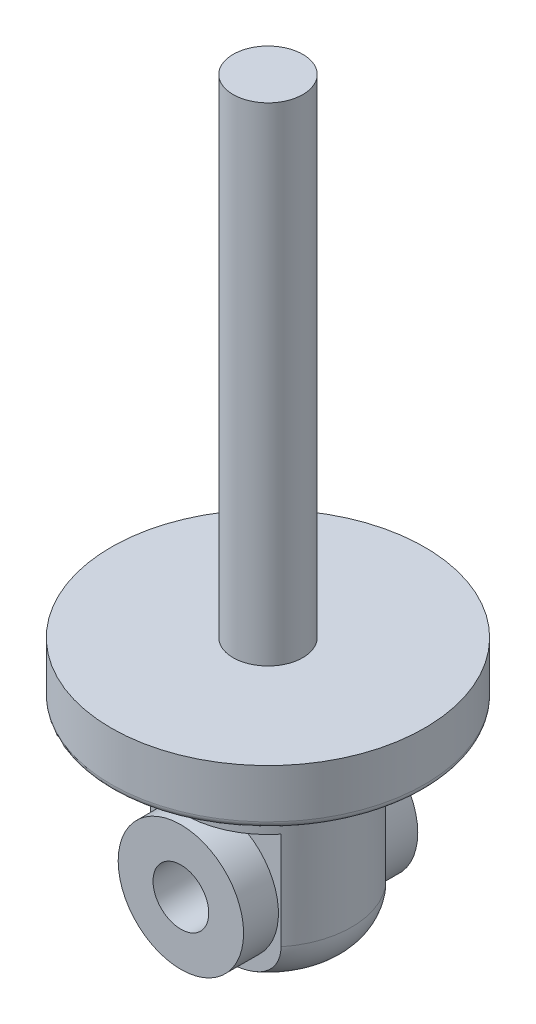
ISO-10303-21;
HEADER;
FILE_DESCRIPTION(('STEP AP214'),'2;1');
FILE_NAME('part.step','',(''),(''),'','','');
FILE_SCHEMA(('AUTOMOTIVE_DESIGN { 1 0 10303 214 1 1 1 1 }'));
ENDSEC;
DATA;
#1=APPLICATION_CONTEXT('core data for automotive mechanical design processes');
#2=APPLICATION_PROTOCOL_DEFINITION('international standard','automotive_design',2000,#1);
#3=PRODUCT_CONTEXT('',#1,'mechanical');
#4=PRODUCT('Part','Part','',(#3));
#5=PRODUCT_RELATED_PRODUCT_CATEGORY('part','',(#4));
#6=PRODUCT_DEFINITION_FORMATION('','',#4);
#7=PRODUCT_DEFINITION_CONTEXT('part definition',#1,'design');
#8=PRODUCT_DEFINITION('design','',#6,#7);
#9=PRODUCT_DEFINITION_SHAPE('','',#8);
#10=(LENGTH_UNIT() NAMED_UNIT(*) SI_UNIT(.MILLI.,.METRE.));
#11=(NAMED_UNIT(*) PLANE_ANGLE_UNIT() SI_UNIT($,.RADIAN.));
#12=(NAMED_UNIT(*) SI_UNIT($,.STERADIAN.) SOLID_ANGLE_UNIT());
#13=UNCERTAINTY_MEASURE_WITH_UNIT(LENGTH_MEASURE(1.E-05),#10,'distance_accuracy_value','');
#14=(GEOMETRIC_REPRESENTATION_CONTEXT(3) GLOBAL_UNCERTAINTY_ASSIGNED_CONTEXT((#13)) GLOBAL_UNIT_ASSIGNED_CONTEXT((#10,
#11,#12)) REPRESENTATION_CONTEXT('',''));
#15=CARTESIAN_POINT('',(0.,0.,0.));
#16=DIRECTION('',(0.,0.,1.));
#17=DIRECTION('',(1.,0.,0.));
#18=AXIS2_PLACEMENT_3D('',#15,#16,#17);
#19=CARTESIAN_POINT('',(-22.5,-28.,-7.5));
#20=DIRECTION('',(0.,0.,1.));
#21=DIRECTION('',(0.,-1.,0.));
#22=AXIS2_PLACEMENT_3D('',#19,#20,#21);
#23=PLANE('',#22);
#24=CARTESIAN_POINT('',(0.,-27.8094750193111,-7.5));
#25=CARTESIAN_POINT('',(-0.18452162824242,-27.8094752958151,-7.5));
#26=CARTESIAN_POINT('',(-0.369043480287192,-27.8077270322999,-7.5));
#27=CARTESIAN_POINT('',(-0.737999394292285,-27.8006130628877,-7.5));
#28=CARTESIAN_POINT('',(-0.922433463434385,-27.7952477367066,-7.5));
#29=CARTESIAN_POINT('',(-1.29122559425462,-27.780538513706,-7.5));
#30=CARTESIAN_POINT('',(-1.47558358999919,-27.7711929215574,-7.5));
#31=CARTESIAN_POINT('',(-1.84401846668315,-27.7479507640883,-7.5));
#32=CARTESIAN_POINT('',(-2.02809534398339,-27.734054140347,-7.5));
#33=CARTESIAN_POINT('',(-2.39498843631837,-27.701027325669,-7.5));
#34=CARTESIAN_POINT('',(-2.57780665418326,-27.6819201299087,-7.5));
#35=CARTESIAN_POINT('',(-2.94269408038083,-27.6375682217561,-7.5));
#36=CARTESIAN_POINT('',(-3.12476323156505,-27.6123230495969,-7.5));
#37=CARTESIAN_POINT('',(-3.6691632505479,-27.5259360262262,-7.5));
#38=CARTESIAN_POINT('',(-4.02997739530099,-27.4541196223952,-7.5));
#39=CARTESIAN_POINT('',(-4.57935988961709,-27.315114172541,-7.5));
#40=CARTESIAN_POINT('',(-4.77122256452969,-27.2608348848703,-7.5));
#41=CARTESIAN_POINT('',(-5.15109529504943,-27.1402411036094,-7.5));
#42=CARTESIAN_POINT('',(-5.33910680786539,-27.0739312594077,-7.5));
#43=CARTESIAN_POINT('',(-5.70992505463463,-26.9281486989919,-7.5));
#44=CARTESIAN_POINT('',(-5.8927332791208,-26.8486797977089,-7.5));
#45=CARTESIAN_POINT('',(-6.25155879665883,-26.6756224712841,-7.5));
#46=CARTESIAN_POINT('',(-6.42757723883459,-26.5820364486501,-7.5));
#47=CARTESIAN_POINT('',(-6.74413785402998,-26.3958384208508,-7.5));
#48=CARTESIAN_POINT('',(-6.8859302136676,-26.3053527427416,-7.5));
#49=CARTESIAN_POINT('',(-7.16205254122039,-26.1136422044668,-7.5));
#50=CARTESIAN_POINT('',(-7.29638393401337,-26.0124194056704,-7.5));
#51=CARTESIAN_POINT('',(-7.55627452274061,-25.7991822855038,-7.5));
#52=CARTESIAN_POINT('',(-7.6818315054992,-25.6871652583255,-7.5));
#53=CARTESIAN_POINT('',(-7.92270374400352,-25.4525813942248,-7.5));
#54=CARTESIAN_POINT('',(-8.03801892249803,-25.3300144777409,-7.5));
#55=CARTESIAN_POINT('',(-8.25792234562975,-25.0736714823962,-7.5));
#56=CARTESIAN_POINT('',(-8.36240569865935,-24.9398051473305,-7.5));
#57=CARTESIAN_POINT('',(-8.55796576900281,-24.662616920615,-7.5));
#58=CARTESIAN_POINT('',(-8.64904436046083,-24.5192963548439,-7.5));
#59=CARTESIAN_POINT('',(-8.81636481076627,-24.2243409104845,-7.5));
#60=CARTESIAN_POINT('',(-8.89261579636783,-24.0727112205184,-7.5));
#61=CARTESIAN_POINT('',(-9.02909243430965,-23.7624095052739,-7.5));
#62=CARTESIAN_POINT('',(-9.08932115899453,-23.6037388369551,-7.5));
#63=CARTESIAN_POINT('',(-9.1849514334904,-23.3052245459151,-7.5));
#64=CARTESIAN_POINT('',(-9.22272405795734,-23.1661361294911,-7.5));
#65=CARTESIAN_POINT('',(-9.28547940350164,-22.8851087613884,-7.5));
#66=CARTESIAN_POINT('',(-9.31046370365637,-22.7431701638949,-7.5));
#67=CARTESIAN_POINT('',(-9.34730641699015,-22.4576599589478,-7.5));
#68=CARTESIAN_POINT('',(-9.35917031033292,-22.3140890586128,-7.5));
#69=CARTESIAN_POINT('',(-9.36963164548865,-22.0264648581988,-7.5));
#70=CARTESIAN_POINT('',(-9.36822954903947,-21.8824115750842,-7.5));
#71=CARTESIAN_POINT('',(-9.35280339576898,-21.6061914815275,-7.5));
#72=CARTESIAN_POINT('',(-9.33976569953801,-21.4739684759153,-7.5));
#73=CARTESIAN_POINT('',(-9.3025636387872,-21.2110534946456,-7.5));
#74=CARTESIAN_POINT('',(-9.27839574533065,-21.0803620180608,-7.5));
#75=CARTESIAN_POINT('',(-9.21922065645586,-20.8215410609612,-7.5));
#76=CARTESIAN_POINT('',(-9.1842198149556,-20.6934101253726,-7.5));
#77=CARTESIAN_POINT('',(-9.1037455253616,-20.4404340442512,-7.5));
#78=CARTESIAN_POINT('',(-9.05826815366643,-20.3155901493276,-7.5));
#79=CARTESIAN_POINT('',(-8.95699564520569,-20.0692031015505,-7.5));
#80=CARTESIAN_POINT('',(-8.90113499399755,-19.9476868658852,-7.5));
#81=CARTESIAN_POINT('',(-8.77987692751896,-19.7094920695403,-7.5));
#82=CARTESIAN_POINT('',(-8.71447610526942,-19.5928152563103,-7.5));
#83=CARTESIAN_POINT('',(-8.50489875856371,-19.2509911073174,-7.5));
#84=CARTESIAN_POINT('',(-8.34729299116934,-19.0339195251877,-7.5));
#85=CARTESIAN_POINT('',(-7.98870608163152,-18.609337427954,-7.5));
#86=CARTESIAN_POINT('',(-7.785297559506,-18.4039002281567,-7.5));
#87=CARTESIAN_POINT('',(-7.35109040646742,-18.0246758733926,-7.5));
#88=CARTESIAN_POINT('',(-7.12029612399674,-17.8508837047537,-7.5));
#89=CARTESIAN_POINT('',(-6.69864287979115,-17.5744409595824,-7.5));
#90=CARTESIAN_POINT('',(-6.51223410047273,-17.4648689537028,-7.5));
#91=CARTESIAN_POINT('',(-6.13034538679085,-17.2626904112623,-7.5));
#92=CARTESIAN_POINT('',(-5.93486117014358,-17.1700919878543,-7.5));
#93=CARTESIAN_POINT('',(-5.53658641063457,-17.0006313082269,-7.5));
#94=CARTESIAN_POINT('',(-5.3337765932138,-16.9238147555949,-7.5));
#95=CARTESIAN_POINT('',(-4.92331428460809,-16.784875362625,-7.5));
#96=CARTESIAN_POINT('',(-4.71566315546473,-16.7227484430634,-7.5));
#97=CARTESIAN_POINT('',(-4.02250667384635,-16.5386673542946,-7.5));
#98=CARTESIAN_POINT('',(-3.52942656369881,-16.4449803111871,-7.5));
#99=CARTESIAN_POINT('',(-2.78498720051465,-16.3412352530644,-7.5));
#100=CARTESIAN_POINT('',(-2.53568557770049,-16.3127705467372,-7.5));
#101=CARTESIAN_POINT('',(-2.03612434937437,-16.2658269581612,-7.5));
#102=CARTESIAN_POINT('',(-1.78586486368141,-16.2473468655649,-7.5));
#103=CARTESIAN_POINT('',(-1.28363112408652,-16.2184283009414,-7.5));
#104=CARTESIAN_POINT('',(-1.0316546617609,-16.208031590786,-7.5));
#105=CARTESIAN_POINT('',(-0.527501194688672,-16.1941849220444,-7.5));
#106=CARTESIAN_POINT('',(-0.275324180848903,-16.1907352988047,-7.5));
#107=CARTESIAN_POINT('',(0.228731345602985,-16.1903333462322,-7.5));
#108=CARTESIAN_POINT('',(0.480609853630185,-16.193373232494,-7.5));
#109=CARTESIAN_POINT('',(0.984173581494278,-16.2063332691715,-7.5));
#110=CARTESIAN_POINT('',(1.23585881660875,-16.2162528039696,-7.5));
#111=CARTESIAN_POINT('',(1.76278825668935,-16.2454935008677,-7.5));
#112=CARTESIAN_POINT('',(2.03798990109172,-16.2656211327378,-7.5));
#113=CARTESIAN_POINT('',(2.58731345976839,-16.3180418431018,-7.5));
#114=CARTESIAN_POINT('',(2.86143522597444,-16.3503365349836,-7.5));
#115=CARTESIAN_POINT('',(3.40623279358437,-16.4300545548583,-7.5));
#116=CARTESIAN_POINT('',(3.67691867401874,-16.4774071358833,-7.5));
#117=CARTESIAN_POINT('',(4.21439476079952,-16.5907053400646,-7.5));
#118=CARTESIAN_POINT('',(4.4811862031647,-16.6566449229111,-7.5));
#119=CARTESIAN_POINT('',(4.94217748017443,-16.7911834026755,-7.5));
#120=CARTESIAN_POINT('',(5.13778160857808,-16.8549558474619,-7.5));
#121=CARTESIAN_POINT('',(5.5239942274174,-16.9961265709521,-7.5));
#122=CARTESIAN_POINT('',(5.71460418712137,-17.073520789267,-7.5));
#123=CARTESIAN_POINT('',(6.0892198722189,-17.2430793617625,-7.5));
#124=CARTESIAN_POINT('',(6.27322442084439,-17.3352463319138,-7.5));
#125=CARTESIAN_POINT('',(6.63256976145457,-17.5351759469553,-7.5));
#126=CARTESIAN_POINT('',(6.80791280693598,-17.6429345063483,-7.5));
#127=CARTESIAN_POINT('',(7.10989658300674,-17.8487615005737,-7.5));
#128=CARTESIAN_POINT('',(7.23870103997639,-17.9436617626469,-7.5));
#129=CARTESIAN_POINT('',(7.48856622066219,-18.143229826346,-7.5));
#130=CARTESIAN_POINT('',(7.60962602152204,-18.2478987883735,-7.5));
#131=CARTESIAN_POINT('',(7.84271387792474,-18.4668045949393,-7.5));
#132=CARTESIAN_POINT('',(7.95474473789612,-18.5810384459287,-7.5));
#133=CARTESIAN_POINT('',(8.16854933672494,-18.8187268203134,-7.5));
#134=CARTESIAN_POINT('',(8.27032449994957,-18.9421800591116,-7.5));
#135=CARTESIAN_POINT('',(8.46313596223061,-19.1987356397018,-7.5));
#136=CARTESIAN_POINT('',(8.55408255407203,-19.3319055781875,-7.5));
#137=CARTESIAN_POINT('',(8.72304401015934,-19.6061418402457,-7.5));
#138=CARTESIAN_POINT('',(8.80106500403696,-19.747204378254,-7.5));
#139=CARTESIAN_POINT('',(8.94309470867639,-20.0362068877473,-7.5));
#140=CARTESIAN_POINT('',(9.00710515749598,-20.1841460034049,-7.5));
#141=CARTESIAN_POINT('',(9.12014361193692,-20.4856380297523,-7.5));
#142=CARTESIAN_POINT('',(9.16917373274798,-20.6391901444676,-7.5));
#143=CARTESIAN_POINT('',(9.24643392787081,-20.9313639562727,-7.5));
#144=CARTESIAN_POINT('',(9.27647685632879,-21.0695088202567,-7.5));
#145=CARTESIAN_POINT('',(9.32406143536891,-21.3479315795213,-7.5));
#146=CARTESIAN_POINT('',(9.34160421520928,-21.4882092809527,-7.5));
#147=CARTESIAN_POINT('',(9.36396002322678,-21.769719609589,-7.5));
#148=CARTESIAN_POINT('',(9.36877802253041,-21.9109518422674,-7.5));
#149=CARTESIAN_POINT('',(9.36563613906261,-22.1932734390957,-7.5));
#150=CARTESIAN_POINT('',(9.35767657732182,-22.3343628067459,-7.5));
#151=CARTESIAN_POINT('',(9.32998563551062,-22.6064011749062,-7.5));
#152=CARTESIAN_POINT('',(9.31102660205278,-22.7374295539783,-7.5));
#153=CARTESIAN_POINT('',(9.26218788836621,-22.9974780227225,-7.5));
#154=CARTESIAN_POINT('',(9.23230470755187,-23.1264974548056,-7.5));
#155=CARTESIAN_POINT('',(9.16196479385525,-23.3815508516768,-7.5));
#156=CARTESIAN_POINT('',(9.12151307666088,-23.5075862018083,-7.5));
#157=CARTESIAN_POINT('',(9.03044888037393,-23.7559772755244,-7.5));
#158=CARTESIAN_POINT('',(8.97983258590813,-23.8783315975104,-7.5));
#159=CARTESIAN_POINT('',(8.8680617574251,-24.1205569584555,-7.5));
#160=CARTESIAN_POINT('',(8.8067487702029,-24.2403549182387,-7.5));
#161=CARTESIAN_POINT('',(8.67480187441993,-24.4747211723639,-7.5));
#162=CARTESIAN_POINT('',(8.60416462323316,-24.5892875713423,-7.5));
#163=CARTESIAN_POINT('',(8.37928997825773,-24.9242270275788,-7.5));
#164=CARTESIAN_POINT('',(8.21201407264851,-25.13600210755,-7.5));
#165=CARTESIAN_POINT('',(7.832942739178,-25.5504485361803,-7.5));
#166=CARTESIAN_POINT('',(7.61853228584699,-25.7507010772538,-7.5));
#167=CARTESIAN_POINT('',(7.16337882817298,-26.1185076671662,-7.5));
#168=CARTESIAN_POINT('',(6.92262753032979,-26.2860513710234,-7.5));
#169=CARTESIAN_POINT('',(6.4788664395953,-26.5545024709803,-7.5));
#170=CARTESIAN_POINT('',(6.279707295078,-26.6619013252763,-7.5));
#171=CARTESIAN_POINT('',(5.87254463104013,-26.858559219587,-7.5));
#172=CARTESIAN_POINT('',(5.66453691936401,-26.9478095430477,-7.5));
#173=CARTESIAN_POINT('',(5.24180758530233,-27.1096214973705,-7.5));
#174=CARTESIAN_POINT('',(5.02707553901331,-27.1821555960046,-7.5));
#175=CARTESIAN_POINT('',(4.59305326757356,-27.3121001369762,-7.5));
#176=CARTESIAN_POINT('',(4.37376133898656,-27.3695048137837,-7.5));
#177=CARTESIAN_POINT('',(3.81417726059937,-27.4981886749365,-7.5));
#178=CARTESIAN_POINT('',(3.4718329690517,-27.5604951716191,-7.5));
#179=CARTESIAN_POINT('',(2.78359200614869,-27.6609019684328,-7.5));
#180=CARTESIAN_POINT('',(2.43769315620305,-27.6989863972919,-7.5));
#181=CARTESIAN_POINT('',(1.91723181279188,-27.7425563308733,-7.5));
#182=CARTESIAN_POINT('',(1.74318957751326,-27.7548291128016,-7.5));
#183=CARTESIAN_POINT('',(1.39487161182967,-27.7753986995787,-7.5));
#184=CARTESIAN_POINT('',(1.22059588725638,-27.7836956019396,-7.5));
#185=CARTESIAN_POINT('',(0.87196539298604,-27.796777523185,-7.5));
#186=CARTESIAN_POINT('',(0.697610658492171,-27.8015635129394,-7.5));
#187=CARTESIAN_POINT('',(0.348837350643893,-27.8079121855994,-7.5));
#188=CARTESIAN_POINT('',(0.174418775305038,-27.8094747579462,-7.5));
#189=CARTESIAN_POINT('',(0.,-27.8094750193111,-7.5));
#190=B_SPLINE_CURVE_WITH_KNOTS('',3,(#24,#25,#26,#27,#28,#29,#30,#31,#32,#33,#34,#35,#36,#37,
#38,#39,#40,#41,#42,#43,#44,#45,#46,#47,#48,#49,#50,#51,#52,#53,#54,#55,#56,#57,#58,#59,#60,#61,
#62,#63,#64,#65,#66,#67,#68,#69,#70,#71,#72,#73,#74,#75,#76,#77,#78,#79,#80,#81,#82,#83,#84,#85,
#86,#87,#88,#89,#90,#91,#92,#93,#94,#95,#96,#97,#98,#99,#100,#101,#102,#103,#104,#105,#106,#107,
#108,#109,#110,#111,#112,#113,#114,#115,#116,#117,#118,#119,#120,#121,#122,#123,#124,#125,#126,
#127,#128,#129,#130,#131,#132,#133,#134,#135,#136,#137,#138,#139,#140,#141,#142,#143,#144,#145,
#146,#147,#148,#149,#150,#151,#152,#153,#154,#155,#156,#157,#158,#159,#160,#161,#162,#163,#164,
#165,#166,#167,#168,#169,#170,#171,#172,#173,#174,#175,#176,#177,#178,#179,#180,#181,#182,#183,
#184,#185,#186,#187,#188,#189),.UNSPECIFIED.,.T.,.F.,(4,2,2,2,2,2,2,2,2,2,2,2,2,2,2,2,2,2,2,2,2,
2,2,2,2,2,2,2,2,2,2,2,2,2,2,2,2,2,2,2,2,2,2,2,2,2,2,2,2,2,2,2,2,2,2,2,2,2,2,2,2,2,2,2,2,2,2,2,2,
2,2,2,2,2,2,2,2,2,2,2,2,2,4),(0.,0.553556541747909,1.10705498067111,1.66078940935171,
2.21453094651203,2.7658672034967,3.31724477121585,4.41912680182767,5.01698525599297,
5.61461314908642,6.21206808675634,6.80942146164093,7.31357153503217,7.81762499361292,
8.32180513447662,8.82598907791494,9.33467160980088,9.84328295415676,10.3515802378956,
10.8597799828438,11.291588037567,11.7233427606026,12.1549170790764,12.5864763761707,
12.9845986570771,13.3828472534997,13.7808627038906,14.1790274594522,14.579795450788,
14.9807069160888,15.7821103743006,16.6461503316802,17.5100532757815,18.1578732554314,
18.8060020817716,19.4559821948789,20.1057815998326,21.6069748462106,22.3596793389022,
23.1122925673176,23.8687687149109,24.6252813779039,25.3808870860739,26.1364251884592,
26.9640249034878,27.7917343993232,28.6156111127982,29.4392203950451,30.0559954213971,
30.6725869093733,31.2892877047367,31.9058271963483,32.3853559200308,32.8649416785199,
33.3443778968313,33.823747436381,34.3068464150843,34.7897156366604,35.2725249226045,
35.7552660053908,36.1788379642465,36.6023716529343,37.0257398573389,37.4490974249689,
37.8458122806135,38.2426543730445,38.639308470493,39.0361117351622,39.4393886143668,
39.8428104576492,40.6491243408277,41.5260051520067,42.403162850804,43.0810551134699,
43.7592721958252,44.4385984678267,45.1181832448308,46.1608437011148,47.2041866484774,
47.7275747628343,48.2509500399341,48.7741805338585,49.2974289735857),.UNSPECIFIED.);
#191=CARTESIAN_POINT('',(9.3674969975976,-22.,-7.5));
#192=VERTEX_POINT('',#191);
#193=CARTESIAN_POINT('',(-9.36749699759765,-21.9999999999999,-7.5));
#194=VERTEX_POINT('',#193);
#195=EDGE_CURVE('E80',#192,#194,#190,.T.);
#196=ORIENTED_EDGE('',*,*,#195,.T.);
#197=DIRECTION('',(0.,1.,0.));
#198=VECTOR('',#197,1.);
#199=CARTESIAN_POINT('',(-9.3674969975976,-28.,-7.5));
#200=LINE('',#199,#198);
#201=CARTESIAN_POINT('',(-9.3674969975976,-8.,-7.49999999999999));
#202=VERTEX_POINT('',#201);
#203=EDGE_CURVE('E76',#202,#194,#200,.F.);
#204=ORIENTED_EDGE('',*,*,#203,.F.);
#205=DIRECTION('',(1.,0.,0.));
#206=VECTOR('',#205,1.);
#207=CARTESIAN_POINT('',(-22.5,-8.,-7.5));
#208=LINE('',#207,#206);
#209=CARTESIAN_POINT('',(9.3674969975976,-8.,-7.49999999999999));
#210=VERTEX_POINT('',#209);
#211=EDGE_CURVE('E79',#202,#210,#208,.T.);
#212=ORIENTED_EDGE('',*,*,#211,.T.);
#213=DIRECTION('',(0.,1.,0.));
#214=VECTOR('',#213,1.);
#215=CARTESIAN_POINT('',(9.3674969975976,-28.,-7.5));
#216=LINE('',#215,#214);
#217=EDGE_CURVE('E50',#192,#210,#216,.T.);
#218=ORIENTED_EDGE('',*,*,#217,.F.);
#219=EDGE_LOOP('',(#196,#204,#212,#218));
#220=FACE_BOUND('',#219,.T.);
#221=CARTESIAN_POINT('',(0.,-18.,-7.5));
#222=DIRECTION('',(0.,0.,1.));
#223=DIRECTION('',(0.,-1.,0.));
#224=AXIS2_PLACEMENT_3D('',#221,#222,#223);
#225=CIRCLE('',#224,9.);
#226=CARTESIAN_POINT('',(0.,-27.,-7.5));
#227=VERTEX_POINT('',#226);
#228=EDGE_CURVE('E109',#227,#227,#225,.F.);
#229=ORIENTED_EDGE('',*,*,#228,.F.);
#230=EDGE_LOOP('',(#229));
#231=FACE_BOUND('',#230,.T.);
#232=ADVANCED_FACE('F35',(#220,#231),#23,.F.);
#233=CARTESIAN_POINT('',(-22.5,-28.,7.5));
#234=DIRECTION('',(0.,0.,-1.));
#235=DIRECTION('',(-1.,0.,0.));
#236=AXIS2_PLACEMENT_3D('',#233,#234,#235);
#237=PLANE('',#236);
#238=CARTESIAN_POINT('',(0.,-27.8094750193111,7.5));
#239=CARTESIAN_POINT('',(0.184521628242419,-27.8094752958151,7.5));
#240=CARTESIAN_POINT('',(0.369043480287191,-27.8077270322999,7.5));
#241=CARTESIAN_POINT('',(0.737999394292284,-27.8006130628877,7.5));
#242=CARTESIAN_POINT('',(0.922433463434384,-27.7952477367066,7.5));
#243=CARTESIAN_POINT('',(1.29122559425462,-27.780538513706,7.5));
#244=CARTESIAN_POINT('',(1.47558358999919,-27.7711929215574,7.5));
#245=CARTESIAN_POINT('',(1.84401846668315,-27.7479507640883,7.5));
#246=CARTESIAN_POINT('',(2.02809534398339,-27.734054140347,7.5));
#247=CARTESIAN_POINT('',(2.39498843631837,-27.701027325669,7.5));
#248=CARTESIAN_POINT('',(2.57780665418326,-27.6819201299087,7.5));
#249=CARTESIAN_POINT('',(2.94269408038083,-27.6375682217561,7.5));
#250=CARTESIAN_POINT('',(3.12476323156505,-27.6123230495969,7.5));
#251=CARTESIAN_POINT('',(3.6691632505479,-27.5259360262262,7.5));
#252=CARTESIAN_POINT('',(4.02997739530099,-27.4541196223952,7.5));
#253=CARTESIAN_POINT('',(4.57935988961709,-27.315114172541,7.5));
#254=CARTESIAN_POINT('',(4.77122256452969,-27.2608348848703,7.5));
#255=CARTESIAN_POINT('',(5.15109529504942,-27.1402411036094,7.5));
#256=CARTESIAN_POINT('',(5.33910680786539,-27.0739312594077,7.5));
#257=CARTESIAN_POINT('',(5.70992505463463,-26.928148698992,7.5));
#258=CARTESIAN_POINT('',(5.8927332791208,-26.8486797977089,7.5));
#259=CARTESIAN_POINT('',(6.25155879665883,-26.6756224712841,7.5));
#260=CARTESIAN_POINT('',(6.42757723883459,-26.5820364486502,7.5));
#261=CARTESIAN_POINT('',(6.74413785402998,-26.3958384208508,7.5));
#262=CARTESIAN_POINT('',(6.8859302136676,-26.3053527427416,7.5));
#263=CARTESIAN_POINT('',(7.16205254122039,-26.1136422044668,7.5));
#264=CARTESIAN_POINT('',(7.29638393401336,-26.0124194056704,7.5));
#265=CARTESIAN_POINT('',(7.55627452274062,-25.7991822855038,7.5));
#266=CARTESIAN_POINT('',(7.6818315054992,-25.6871652583255,7.5));
#267=CARTESIAN_POINT('',(7.92270374400352,-25.4525813942248,7.5));
#268=CARTESIAN_POINT('',(8.03801892249803,-25.3300144777409,7.5));
#269=CARTESIAN_POINT('',(8.25792234562976,-25.0736714823962,7.5));
#270=CARTESIAN_POINT('',(8.36240569865935,-24.9398051473305,7.5));
#271=CARTESIAN_POINT('',(8.55796576900282,-24.662616920615,7.5));
#272=CARTESIAN_POINT('',(8.64904436046083,-24.5192963548439,7.5));
#273=CARTESIAN_POINT('',(8.81636481076627,-24.2243409104845,7.5));
#274=CARTESIAN_POINT('',(8.89261579636784,-24.0727112205184,7.5));
#275=CARTESIAN_POINT('',(9.02909243430965,-23.7624095052739,7.5));
#276=CARTESIAN_POINT('',(9.08932115899454,-23.6037388369551,7.5));
#277=CARTESIAN_POINT('',(9.1849514334904,-23.3052245459151,7.5));
#278=CARTESIAN_POINT('',(9.22272405795734,-23.166136129491,7.5));
#279=CARTESIAN_POINT('',(9.28547940350164,-22.8851087613884,7.5));
#280=CARTESIAN_POINT('',(9.31046370365637,-22.7431701638949,7.5));
#281=CARTESIAN_POINT('',(9.34730641699016,-22.4576599589478,7.5));
#282=CARTESIAN_POINT('',(9.35917031033292,-22.3140890586128,7.5));
#283=CARTESIAN_POINT('',(9.36963164548865,-22.0264648581988,7.5));
#284=CARTESIAN_POINT('',(9.36822954903948,-21.8824115750842,7.5));
#285=CARTESIAN_POINT('',(9.35280339576898,-21.6061914815275,7.5));
#286=CARTESIAN_POINT('',(9.33976569953801,-21.4739684759153,7.5));
#287=CARTESIAN_POINT('',(9.30256363878721,-21.2110534946456,7.5));
#288=CARTESIAN_POINT('',(9.27839574533066,-21.0803620180608,7.5));
#289=CARTESIAN_POINT('',(9.21922065645586,-20.8215410609612,7.5));
#290=CARTESIAN_POINT('',(9.18421981495561,-20.6934101253726,7.5));
#291=CARTESIAN_POINT('',(9.1037455253616,-20.4404340442512,7.5));
#292=CARTESIAN_POINT('',(9.05826815366643,-20.3155901493276,7.5));
#293=CARTESIAN_POINT('',(8.95699564520569,-20.0692031015505,7.5));
#294=CARTESIAN_POINT('',(8.90113499399755,-19.9476868658852,7.5));
#295=CARTESIAN_POINT('',(8.77987692751896,-19.7094920695403,7.5));
#296=CARTESIAN_POINT('',(8.71447610526943,-19.5928152563103,7.5));
#297=CARTESIAN_POINT('',(8.50489875856371,-19.2509911073174,7.5));
#298=CARTESIAN_POINT('',(8.34729299116934,-19.0339195251877,7.5));
#299=CARTESIAN_POINT('',(7.98870608163152,-18.609337427954,7.5));
#300=CARTESIAN_POINT('',(7.78529755950601,-18.4039002281567,7.5));
#301=CARTESIAN_POINT('',(7.35109040646742,-18.0246758733926,7.5));
#302=CARTESIAN_POINT('',(7.12029612399674,-17.8508837047537,7.5));
#303=CARTESIAN_POINT('',(6.69864287979115,-17.5744409595824,7.5));
#304=CARTESIAN_POINT('',(6.51223410047273,-17.4648689537028,7.5));
#305=CARTESIAN_POINT('',(6.13034538679086,-17.2626904112622,7.5));
#306=CARTESIAN_POINT('',(5.93486117014358,-17.1700919878543,7.5));
#307=CARTESIAN_POINT('',(5.53658641063457,-17.0006313082269,7.5));
#308=CARTESIAN_POINT('',(5.3337765932138,-16.9238147555949,7.5));
#309=CARTESIAN_POINT('',(4.9233142846081,-16.784875362625,7.5));
#310=CARTESIAN_POINT('',(4.71566315546474,-16.7227484430634,7.5));
#311=CARTESIAN_POINT('',(4.02250667384635,-16.5386673542946,7.5));
#312=CARTESIAN_POINT('',(3.52942656369881,-16.4449803111871,7.5));
#313=CARTESIAN_POINT('',(2.78498720051466,-16.3412352530644,7.5));
#314=CARTESIAN_POINT('',(2.53568557770049,-16.3127705467372,7.5));
#315=CARTESIAN_POINT('',(2.03612434937438,-16.2658269581612,7.5));
#316=CARTESIAN_POINT('',(1.78586486368141,-16.2473468655649,7.5));
#317=CARTESIAN_POINT('',(1.28363112408652,-16.2184283009414,7.5));
#318=CARTESIAN_POINT('',(1.03165466176091,-16.208031590786,7.5));
#319=CARTESIAN_POINT('',(0.527501194688674,-16.1941849220443,7.5));
#320=CARTESIAN_POINT('',(0.275324180848906,-16.1907352988047,7.5));
#321=CARTESIAN_POINT('',(-0.228731345602982,-16.1903333462322,7.5));
#322=CARTESIAN_POINT('',(-0.480609853630181,-16.193373232494,7.5));
#323=CARTESIAN_POINT('',(-0.984173581494274,-16.2063332691715,7.5));
#324=CARTESIAN_POINT('',(-1.23585881660875,-16.2162528039696,7.5));
#325=CARTESIAN_POINT('',(-1.76278825668934,-16.2454935008677,7.5));
#326=CARTESIAN_POINT('',(-2.03798990109172,-16.2656211327378,7.5));
#327=CARTESIAN_POINT('',(-2.58731345976839,-16.3180418431018,7.5));
#328=CARTESIAN_POINT('',(-2.86143522597444,-16.3503365349836,7.5));
#329=CARTESIAN_POINT('',(-3.40623279358437,-16.4300545548583,7.5));
#330=CARTESIAN_POINT('',(-3.67691867401873,-16.4774071358833,7.5));
#331=CARTESIAN_POINT('',(-4.21439476079951,-16.5907053400646,7.5));
#332=CARTESIAN_POINT('',(-4.4811862031647,-16.6566449229111,7.5));
#333=CARTESIAN_POINT('',(-4.94217748017443,-16.7911834026755,7.5));
#334=CARTESIAN_POINT('',(-5.13778160857807,-16.8549558474619,7.5));
#335=CARTESIAN_POINT('',(-5.5239942274174,-16.9961265709521,7.5));
#336=CARTESIAN_POINT('',(-5.71460418712137,-17.0735207892669,7.5));
#337=CARTESIAN_POINT('',(-6.08921987221889,-17.2430793617625,7.5));
#338=CARTESIAN_POINT('',(-6.27322442084438,-17.3352463319138,7.5));
#339=CARTESIAN_POINT('',(-6.63256976145457,-17.5351759469553,7.5));
#340=CARTESIAN_POINT('',(-6.80791280693598,-17.6429345063483,7.5));
#341=CARTESIAN_POINT('',(-7.10989658300674,-17.8487615005736,7.5));
#342=CARTESIAN_POINT('',(-7.2387010399764,-17.9436617626469,7.5));
#343=CARTESIAN_POINT('',(-7.48856622066219,-18.143229826346,7.5));
#344=CARTESIAN_POINT('',(-7.60962602152205,-18.2478987883735,7.5));
#345=CARTESIAN_POINT('',(-7.84271387792475,-18.4668045949393,7.5));
#346=CARTESIAN_POINT('',(-7.95474473789613,-18.5810384459287,7.5));
#347=CARTESIAN_POINT('',(-8.16854933672495,-18.8187268203134,7.5));
#348=CARTESIAN_POINT('',(-8.27032449994957,-18.9421800591116,7.5));
#349=CARTESIAN_POINT('',(-8.46313596223061,-19.1987356397018,7.5));
#350=CARTESIAN_POINT('',(-8.55408255407203,-19.3319055781875,7.5));
#351=CARTESIAN_POINT('',(-8.72304401015934,-19.6061418402457,7.5));
#352=CARTESIAN_POINT('',(-8.80106500403696,-19.747204378254,7.5));
#353=CARTESIAN_POINT('',(-8.94309470867639,-20.0362068877473,7.5));
#354=CARTESIAN_POINT('',(-9.00710515749599,-20.1841460034049,7.5));
#355=CARTESIAN_POINT('',(-9.12014361193693,-20.4856380297523,7.5));
#356=CARTESIAN_POINT('',(-9.16917373274799,-20.6391901444676,7.5));
#357=CARTESIAN_POINT('',(-9.24643392787081,-20.9313639562727,7.5));
#358=CARTESIAN_POINT('',(-9.2764768563288,-21.0695088202567,7.5));
#359=CARTESIAN_POINT('',(-9.32406143536891,-21.3479315795213,7.5));
#360=CARTESIAN_POINT('',(-9.34160421520928,-21.4882092809527,7.5));
#361=CARTESIAN_POINT('',(-9.36396002322679,-21.769719609589,7.5));
#362=CARTESIAN_POINT('',(-9.36877802253041,-21.9109518422674,7.5));
#363=CARTESIAN_POINT('',(-9.36563613906261,-22.1932734390957,7.5));
#364=CARTESIAN_POINT('',(-9.35767657732182,-22.3343628067459,7.5));
#365=CARTESIAN_POINT('',(-9.32998563551063,-22.6064011749062,7.5));
#366=CARTESIAN_POINT('',(-9.31102660205279,-22.7374295539783,7.5));
#367=CARTESIAN_POINT('',(-9.26218788836622,-22.9974780227225,7.5));
#368=CARTESIAN_POINT('',(-9.23230470755187,-23.1264974548056,7.5));
#369=CARTESIAN_POINT('',(-9.16196479385525,-23.3815508516768,7.5));
#370=CARTESIAN_POINT('',(-9.12151307666088,-23.5075862018084,7.5));
#371=CARTESIAN_POINT('',(-9.03044888037393,-23.7559772755244,7.5));
#372=CARTESIAN_POINT('',(-8.97983258590813,-23.8783315975104,7.5));
#373=CARTESIAN_POINT('',(-8.8680617574251,-24.1205569584555,7.5));
#374=CARTESIAN_POINT('',(-8.8067487702029,-24.2403549182387,7.5));
#375=CARTESIAN_POINT('',(-8.67480187441993,-24.4747211723639,7.5));
#376=CARTESIAN_POINT('',(-8.60416462323317,-24.5892875713423,7.5));
#377=CARTESIAN_POINT('',(-8.37928997825773,-24.9242270275788,7.5));
#378=CARTESIAN_POINT('',(-8.21201407264852,-25.13600210755,7.5));
#379=CARTESIAN_POINT('',(-7.832942739178,-25.5504485361803,7.5));
#380=CARTESIAN_POINT('',(-7.61853228584699,-25.7507010772538,7.5));
#381=CARTESIAN_POINT('',(-7.16337882817298,-26.1185076671662,7.5));
#382=CARTESIAN_POINT('',(-6.92262753032979,-26.2860513710234,7.5));
#383=CARTESIAN_POINT('',(-6.4788664395953,-26.5545024709803,7.5));
#384=CARTESIAN_POINT('',(-6.27970729507799,-26.6619013252763,7.5));
#385=CARTESIAN_POINT('',(-5.87254463104012,-26.858559219587,7.5));
#386=CARTESIAN_POINT('',(-5.66453691936401,-26.9478095430477,7.5));
#387=CARTESIAN_POINT('',(-5.24180758530232,-27.1096214973705,7.5));
#388=CARTESIAN_POINT('',(-5.02707553901331,-27.1821555960046,7.5));
#389=CARTESIAN_POINT('',(-4.59305326757355,-27.3121001369762,7.5));
#390=CARTESIAN_POINT('',(-4.37376133898656,-27.3695048137837,7.5));
#391=CARTESIAN_POINT('',(-3.81417726059936,-27.4981886749365,7.5));
#392=CARTESIAN_POINT('',(-3.47183296905169,-27.5604951716191,7.5));
#393=CARTESIAN_POINT('',(-2.78359200614869,-27.6609019684328,7.5));
#394=CARTESIAN_POINT('',(-2.43769315620305,-27.6989863972919,7.5));
#395=CARTESIAN_POINT('',(-1.91723181279187,-27.7425563308733,7.5));
#396=CARTESIAN_POINT('',(-1.74318957751326,-27.7548291128016,7.5));
#397=CARTESIAN_POINT('',(-1.39487161182967,-27.7753986995787,7.5));
#398=CARTESIAN_POINT('',(-1.22059588725638,-27.7836956019396,7.5));
#399=CARTESIAN_POINT('',(-0.871965392986039,-27.796777523185,7.5));
#400=CARTESIAN_POINT('',(-0.697610658492171,-27.8015635129394,7.5));
#401=CARTESIAN_POINT('',(-0.348837350643893,-27.8079121855994,7.5));
#402=CARTESIAN_POINT('',(-0.174418775305038,-27.8094747579462,7.5));
#403=CARTESIAN_POINT('',(0.,-27.8094750193111,7.5));
#404=B_SPLINE_CURVE_WITH_KNOTS('',3,(#238,#239,#240,#241,#242,#243,#244,#245,#246,#247,#248,
#249,#250,#251,#252,#253,#254,#255,#256,#257,#258,#259,#260,#261,#262,#263,#264,#265,#266,#267,
#268,#269,#270,#271,#272,#273,#274,#275,#276,#277,#278,#279,#280,#281,#282,#283,#284,#285,#286,
#287,#288,#289,#290,#291,#292,#293,#294,#295,#296,#297,#298,#299,#300,#301,#302,#303,#304,#305,
#306,#307,#308,#309,#310,#311,#312,#313,#314,#315,#316,#317,#318,#319,#320,#321,#322,#323,#324,
#325,#326,#327,#328,#329,#330,#331,#332,#333,#334,#335,#336,#337,#338,#339,#340,#341,#342,#343,
#344,#345,#346,#347,#348,#349,#350,#351,#352,#353,#354,#355,#356,#357,#358,#359,#360,#361,#362,
#363,#364,#365,#366,#367,#368,#369,#370,#371,#372,#373,#374,#375,#376,#377,#378,#379,#380,#381,
#382,#383,#384,#385,#386,#387,#388,#389,#390,#391,#392,#393,#394,#395,#396,#397,#398,#399,#400,
#401,#402,#403),.UNSPECIFIED.,.T.,.F.,(4,2,2,2,2,2,2,2,2,2,2,2,2,2,2,2,2,2,2,2,2,2,2,2,2,2,2,2,
2,2,2,2,2,2,2,2,2,2,2,2,2,2,2,2,2,2,2,2,2,2,2,2,2,2,2,2,2,2,2,2,2,2,2,2,2,2,2,2,2,2,2,2,2,2,2,2,
2,2,2,2,2,2,4),(0.,0.553556541747908,1.10705498067111,1.6607894093517,2.21453094651203,
2.76586720349669,3.31724477121585,4.41912680182766,5.01698525599297,5.61461314908642,
6.21206808675634,6.80942146164093,7.31357153503217,7.81762499361292,8.32180513447662,
8.82598907791494,9.33467160980088,9.84328295415677,10.3515802378956,10.8597799828438,
11.291588037567,11.7233427606026,12.1549170790764,12.5864763761707,12.9845986570771,
13.3828472534997,13.7808627038906,14.1790274594522,14.5797954507881,14.9807069160888,
15.7821103743006,16.6461503316802,17.5100532757815,18.1578732554314,18.8060020817716,
19.4559821948789,20.1057815998326,21.6069748462106,22.3596793389022,23.1122925673176,
23.8687687149109,24.6252813779039,25.3808870860739,26.1364251884592,26.9640249034878,
27.7917343993232,28.6156111127982,29.4392203950451,30.0559954213972,30.6725869093733,
31.2892877047367,31.9058271963483,32.3853559200308,32.86494167852,33.3443778968313,
33.823747436381,34.3068464150844,34.7897156366604,35.2725249226045,35.7552660053908,
36.1788379642465,36.6023716529343,37.0257398573389,37.4490974249689,37.8458122806135,
38.2426543730445,38.639308470493,39.0361117351622,39.4393886143668,39.8428104576492,
40.6491243408277,41.5260051520067,42.403162850804,43.0810551134699,43.7592721958252,
44.4385984678267,45.1181832448308,46.1608437011148,47.2041866484774,47.7275747628343,
48.2509500399341,48.7741805338585,49.2974289735857),.UNSPECIFIED.);
#405=CARTESIAN_POINT('',(-9.3674969975976,-22.,7.5));
#406=VERTEX_POINT('',#405);
#407=CARTESIAN_POINT('',(9.36749699759766,-21.9999999999999,7.5));
#408=VERTEX_POINT('',#407);
#409=EDGE_CURVE('E96',#406,#408,#404,.T.);
#410=ORIENTED_EDGE('',*,*,#409,.T.);
#411=DIRECTION('',(0.,1.,0.));
#412=VECTOR('',#411,1.);
#413=CARTESIAN_POINT('',(9.3674969975976,-28.,7.49999999999999));
#414=LINE('',#413,#412);
#415=CARTESIAN_POINT('',(9.3674969975976,-8.,7.49999999999999));
#416=VERTEX_POINT('',#415);
#417=EDGE_CURVE('E124',#416,#408,#414,.F.);
#418=ORIENTED_EDGE('',*,*,#417,.F.);
#419=DIRECTION('',(1.,0.,0.));
#420=VECTOR('',#419,1.);
#421=CARTESIAN_POINT('',(-22.5,-8.,7.5));
#422=LINE('',#421,#420);
#423=CARTESIAN_POINT('',(-9.3674969975976,-8.,7.49999999999999));
#424=VERTEX_POINT('',#423);
#425=EDGE_CURVE('E85',#424,#416,#422,.T.);
#426=ORIENTED_EDGE('',*,*,#425,.F.);
#427=DIRECTION('',(0.,1.,0.));
#428=VECTOR('',#427,1.);
#429=CARTESIAN_POINT('',(-9.3674969975976,-28.,7.49999999999999));
#430=LINE('',#429,#428);
#431=EDGE_CURVE('E58',#406,#424,#430,.T.);
#432=ORIENTED_EDGE('',*,*,#431,.F.);
#433=EDGE_LOOP('',(#410,#418,#426,#432));
#434=FACE_BOUND('',#433,.T.);
#435=CARTESIAN_POINT('',(0.,-18.,7.5));
#436=DIRECTION('',(0.,0.,-1.));
#437=DIRECTION('',(-1.,0.,0.));
#438=AXIS2_PLACEMENT_3D('',#435,#436,#437);
#439=CIRCLE('',#438,9.);
#440=CARTESIAN_POINT('',(-9.,-18.,7.5));
#441=VERTEX_POINT('',#440);
#442=EDGE_CURVE('E99',#441,#441,#439,.F.);
#443=ORIENTED_EDGE('',*,*,#442,.F.);
#444=EDGE_LOOP('',(#443));
#445=FACE_BOUND('',#444,.T.);
#446=ADVANCED_FACE('F155',(#434,#445),#237,.F.);
#447=CARTESIAN_POINT('',(0.,8.,0.));
#448=DIRECTION('',(0.,-1.,0.));
#449=DIRECTION('',(0.,0.,-1.));
#450=AXIS2_PLACEMENT_3D('',#447,#448,#449);
#451=CYLINDRICAL_SURFACE('',#450,22.5);
#452=CARTESIAN_POINT('',(0.,1.,0.));
#453=DIRECTION('',(0.,1.,0.));
#454=DIRECTION('',(0.,0.,1.));
#455=AXIS2_PLACEMENT_3D('',#452,#453,#454);
#456=CIRCLE('',#455,22.5);
#457=CARTESIAN_POINT('',(0.,1.,22.5));
#458=VERTEX_POINT('',#457);
#459=EDGE_CURVE('E43',#458,#458,#456,.T.);
#460=ORIENTED_EDGE('',*,*,#459,.T.);
#461=EDGE_LOOP('',(#460));
#462=FACE_BOUND('',#461,.T.);
#463=CARTESIAN_POINT('',(0.,8.,0.));
#464=DIRECTION('',(0.,1.,0.));
#465=DIRECTION('',(0.,0.,1.));
#466=AXIS2_PLACEMENT_3D('',#463,#464,#465);
#467=CIRCLE('',#466,22.5);
#468=CARTESIAN_POINT('',(0.,8.,22.5));
#469=VERTEX_POINT('',#468);
#470=EDGE_CURVE('E136',#469,#469,#467,.T.);
#471=ORIENTED_EDGE('',*,*,#470,.F.);
#472=EDGE_LOOP('',(#471));
#473=FACE_BOUND('',#472,.T.);
#474=ADVANCED_FACE('F179',(#462,#473),#451,.T.);
#475=CARTESIAN_POINT('',(0.,8.,0.));
#476=DIRECTION('',(0.,1.,0.));
#477=DIRECTION('',(0.,0.,1.));
#478=AXIS2_PLACEMENT_3D('',#475,#476,#477);
#479=PLANE('',#478);
#480=CARTESIAN_POINT('',(0.,8.,0.));
#481=DIRECTION('',(0.,1.,0.));
#482=DIRECTION('',(0.,0.,1.));
#483=AXIS2_PLACEMENT_3D('',#480,#481,#482);
#484=CIRCLE('',#483,5.);
#485=CARTESIAN_POINT('',(0.,8.,5.));
#486=VERTEX_POINT('',#485);
#487=EDGE_CURVE('E133',#486,#486,#484,.T.);
#488=ORIENTED_EDGE('',*,*,#487,.F.);
#489=EDGE_LOOP('',(#488));
#490=FACE_BOUND('',#489,.T.);
#491=ORIENTED_EDGE('',*,*,#470,.T.);
#492=EDGE_LOOP('',(#491));
#493=FACE_BOUND('',#492,.T.);
#494=ADVANCED_FACE('F176',(#490,#493),#479,.T.);
#495=CARTESIAN_POINT('',(0.,0.,0.));
#496=DIRECTION('',(0.,1.,0.));
#497=DIRECTION('',(0.,0.,1.));
#498=AXIS2_PLACEMENT_3D('',#495,#496,#497);
#499=PLANE('',#498);
#500=CARTESIAN_POINT('',(0.,0.,0.));
#501=DIRECTION('',(0.,1.,0.));
#502=DIRECTION('',(0.,0.,1.));
#503=AXIS2_PLACEMENT_3D('',#500,#501,#502);
#504=CIRCLE('',#503,21.5);
#505=CARTESIAN_POINT('',(0.,0.,21.5));
#506=VERTEX_POINT('',#505);
#507=EDGE_CURVE('E11',#506,#506,#504,.F.);
#508=ORIENTED_EDGE('',*,*,#507,.T.);
#509=EDGE_LOOP('',(#508));
#510=FACE_BOUND('',#509,.T.);
#511=CARTESIAN_POINT('',(0.,0.,0.));
#512=DIRECTION('',(0.,-1.,0.));
#513=DIRECTION('',(0.,0.,-1.));
#514=AXIS2_PLACEMENT_3D('',#511,#512,#513);
#515=CIRCLE('',#514,12.);
#516=CARTESIAN_POINT('',(0.,0.,-12.));
#517=VERTEX_POINT('',#516);
#518=EDGE_CURVE('E129',#517,#517,#515,.T.);
#519=ORIENTED_EDGE('',*,*,#518,.F.);
#520=EDGE_LOOP('',(#519));
#521=FACE_BOUND('',#520,.T.);
#522=ADVANCED_FACE('F174',(#510,#521),#499,.F.);
#523=CARTESIAN_POINT('',(0.,78.,0.));
#524=DIRECTION('',(0.,-1.,0.));
#525=DIRECTION('',(0.,0.,-1.));
#526=AXIS2_PLACEMENT_3D('',#523,#524,#525);
#527=CYLINDRICAL_SURFACE('',#526,5.);
#528=CARTESIAN_POINT('',(0.,78.,0.));
#529=DIRECTION('',(0.,1.,0.));
#530=DIRECTION('',(0.,0.,1.));
#531=AXIS2_PLACEMENT_3D('',#528,#529,#530);
#532=CIRCLE('',#531,5.);
#533=CARTESIAN_POINT('',(0.,78.,5.));
#534=VERTEX_POINT('',#533);
#535=EDGE_CURVE('E128',#534,#534,#532,.T.);
#536=ORIENTED_EDGE('',*,*,#535,.F.);
#537=EDGE_LOOP('',(#536));
#538=FACE_BOUND('',#537,.T.);
#539=ORIENTED_EDGE('',*,*,#487,.T.);
#540=EDGE_LOOP('',(#539));
#541=FACE_BOUND('',#540,.T.);
#542=ADVANCED_FACE('F170',(#538,#541),#527,.T.);
#543=CARTESIAN_POINT('',(0.,78.,0.));
#544=DIRECTION('',(0.,1.,0.));
#545=DIRECTION('',(0.,0.,1.));
#546=AXIS2_PLACEMENT_3D('',#543,#544,#545);
#547=PLANE('',#546);
#548=ORIENTED_EDGE('',*,*,#535,.T.);
#549=EDGE_LOOP('',(#548));
#550=FACE_BOUND('',#549,.T.);
#551=ADVANCED_FACE('F167',(#550),#547,.T.);
#552=CARTESIAN_POINT('',(0.,-28.,0.));
#553=DIRECTION('',(0.,1.,0.));
#554=DIRECTION('',(0.,0.,1.));
#555=AXIS2_PLACEMENT_3D('',#552,#553,#554);
#556=CYLINDRICAL_SURFACE('',#555,12.);
#557=CARTESIAN_POINT('',(0.,-22.,0.));
#558=DIRECTION('',(0.,-1.,0.));
#559=DIRECTION('',(0.,0.,-1.));
#560=AXIS2_PLACEMENT_3D('',#557,#558,#559);
#561=CIRCLE('',#560,12.);
#562=EDGE_CURVE('E144',#194,#406,#561,.F.);
#563=ORIENTED_EDGE('',*,*,#562,.T.);
#564=ORIENTED_EDGE('',*,*,#431,.T.);
#565=CARTESIAN_POINT('',(0.,-8.,0.));
#566=DIRECTION('',(0.,1.,0.));
#567=DIRECTION('',(0.,0.,1.));
#568=AXIS2_PLACEMENT_3D('',#565,#566,#567);
#569=CIRCLE('',#568,12.);
#570=EDGE_CURVE('E95',#424,#416,#569,.T.);
#571=ORIENTED_EDGE('',*,*,#570,.T.);
#572=ORIENTED_EDGE('',*,*,#417,.T.);
#573=EDGE_CURVE('E143',#408,#192,#561,.F.);
#574=ORIENTED_EDGE('',*,*,#573,.T.);
#575=ORIENTED_EDGE('',*,*,#217,.T.);
#576=CARTESIAN_POINT('',(0.,-8.,0.));
#577=DIRECTION('',(0.,1.,0.));
#578=DIRECTION('',(0.,0.,1.));
#579=AXIS2_PLACEMENT_3D('',#576,#577,#578);
#580=CIRCLE('',#579,12.);
#581=EDGE_CURVE('E89',#210,#202,#580,.T.);
#582=ORIENTED_EDGE('',*,*,#581,.T.);
#583=ORIENTED_EDGE('',*,*,#203,.T.);
#584=EDGE_LOOP('',(#563,#564,#571,#572,#574,#575,#582,#583));
#585=FACE_BOUND('',#584,.T.);
#586=ORIENTED_EDGE('',*,*,#518,.T.);
#587=EDGE_LOOP('',(#586));
#588=FACE_BOUND('',#587,.T.);
#589=ADVANCED_FACE('F92',(#585,#588),#556,.T.);
#590=CARTESIAN_POINT('',(0.,-28.,0.));
#591=DIRECTION('',(0.,-1.,0.));
#592=DIRECTION('',(0.,0.,-1.));
#593=AXIS2_PLACEMENT_3D('',#590,#591,#592);
#594=PLANE('',#593);
#595=CARTESIAN_POINT('',(0.,-28.,0.));
#596=DIRECTION('',(0.,-1.,0.));
#597=DIRECTION('',(0.,0.,-1.));
#598=AXIS2_PLACEMENT_3D('',#595,#596,#597);
#599=CIRCLE('',#598,6.);
#600=CARTESIAN_POINT('',(0.,-28.,-6.));
#601=VERTEX_POINT('',#600);
#602=EDGE_CURVE('E132',#601,#601,#599,.T.);
#603=ORIENTED_EDGE('',*,*,#602,.T.);
#604=EDGE_LOOP('',(#603));
#605=FACE_BOUND('',#604,.T.);
#606=ADVANCED_FACE('F161',(#605),#594,.T.);
#607=CARTESIAN_POINT('',(0.,-22.,0.));
#608=DIRECTION('',(0.,-1.,0.));
#609=DIRECTION('',(0.,0.,-1.));
#610=AXIS2_PLACEMENT_3D('',#607,#608,#609);
#611=TOROIDAL_SURFACE('',#610,6.,6.);
#612=ORIENTED_EDGE('',*,*,#409,.F.);
#613=ORIENTED_EDGE('',*,*,#562,.F.);
#614=ORIENTED_EDGE('',*,*,#195,.F.);
#615=ORIENTED_EDGE('',*,*,#573,.F.);
#616=EDGE_LOOP('',(#612,#613,#614,#615));
#617=FACE_BOUND('',#616,.T.);
#618=ORIENTED_EDGE('',*,*,#602,.F.);
#619=EDGE_LOOP('',(#618));
#620=FACE_BOUND('',#619,.T.);
#621=ADVANCED_FACE('F149',(#617,#620),#611,.T.);
#622=CARTESIAN_POINT('',(-22.5,-8.,-7.5));
#623=DIRECTION('',(0.,1.,0.));
#624=DIRECTION('',(0.,0.,1.));
#625=AXIS2_PLACEMENT_3D('',#622,#623,#624);
#626=PLANE('',#625);
#627=ORIENTED_EDGE('',*,*,#211,.F.);
#628=ORIENTED_EDGE('',*,*,#581,.F.);
#629=EDGE_LOOP('',(#627,#628));
#630=FACE_BOUND('',#629,.T.);
#631=ADVANCED_FACE('F88',(#630),#626,.F.);
#632=CARTESIAN_POINT('',(-22.5,-8.,7.5));
#633=DIRECTION('',(0.,1.,0.));
#634=DIRECTION('',(0.,0.,1.));
#635=AXIS2_PLACEMENT_3D('',#632,#633,#634);
#636=PLANE('',#635);
#637=ORIENTED_EDGE('',*,*,#425,.T.);
#638=ORIENTED_EDGE('',*,*,#570,.F.);
#639=EDGE_LOOP('',(#637,#638));
#640=FACE_BOUND('',#639,.T.);
#641=ADVANCED_FACE('F160',(#640),#636,.F.);
#642=CARTESIAN_POINT('',(0.,-18.,12.5));
#643=DIRECTION('',(0.,0.,-1.));
#644=DIRECTION('',(-1.,0.,0.));
#645=AXIS2_PLACEMENT_3D('',#642,#643,#644);
#646=CYLINDRICAL_SURFACE('',#645,9.);
#647=CARTESIAN_POINT('',(0.,-18.,12.5));
#648=DIRECTION('',(0.,0.,1.));
#649=DIRECTION('',(1.,0.,0.));
#650=AXIS2_PLACEMENT_3D('',#647,#648,#649);
#651=CIRCLE('',#650,9.);
#652=CARTESIAN_POINT('',(9.,-18.,12.5));
#653=VERTEX_POINT('',#652);
#654=EDGE_CURVE('E90',#653,#653,#651,.T.);
#655=ORIENTED_EDGE('',*,*,#654,.F.);
#656=EDGE_LOOP('',(#655));
#657=FACE_BOUND('',#656,.T.);
#658=ORIENTED_EDGE('',*,*,#442,.T.);
#659=EDGE_LOOP('',(#658));
#660=FACE_BOUND('',#659,.T.);
#661=ADVANCED_FACE('F195',(#657,#660),#646,.T.);
#662=CARTESIAN_POINT('',(0.,-18.,12.5));
#663=DIRECTION('',(0.,0.,1.));
#664=DIRECTION('',(1.,0.,0.));
#665=AXIS2_PLACEMENT_3D('',#662,#663,#664);
#666=PLANE('',#665);
#667=ORIENTED_EDGE('',*,*,#654,.T.);
#668=EDGE_LOOP('',(#667));
#669=FACE_BOUND('',#668,.T.);
#670=CARTESIAN_POINT('',(0.,-18.,12.5));
#671=DIRECTION('',(0.,0.,1.));
#672=DIRECTION('',(1.,0.,0.));
#673=AXIS2_PLACEMENT_3D('',#670,#671,#672);
#674=CIRCLE('',#673,4.);
#675=CARTESIAN_POINT('',(4.,-18.,12.5));
#676=VERTEX_POINT('',#675);
#677=EDGE_CURVE('E223',#676,#676,#674,.T.);
#678=ORIENTED_EDGE('',*,*,#677,.F.);
#679=EDGE_LOOP('',(#678));
#680=FACE_BOUND('',#679,.T.);
#681=ADVANCED_FACE('F197',(#669,#680),#666,.T.);
#682=CARTESIAN_POINT('',(0.,-18.,20.5));
#683=DIRECTION('',(0.,0.,-1.));
#684=DIRECTION('',(0.,1.,0.));
#685=AXIS2_PLACEMENT_3D('',#682,#683,#684);
#686=CYLINDRICAL_SURFACE('',#685,4.);
#687=ORIENTED_EDGE('',*,*,#677,.T.);
#688=EDGE_LOOP('',(#687));
#689=FACE_BOUND('',#688,.T.);
#690=CARTESIAN_POINT('',(0.,-18.,-12.5));
#691=DIRECTION('',(0.,0.,1.));
#692=DIRECTION('',(1.,0.,0.));
#693=AXIS2_PLACEMENT_3D('',#690,#691,#692);
#694=CIRCLE('',#693,4.);
#695=CARTESIAN_POINT('',(4.,-18.,-12.5));
#696=VERTEX_POINT('',#695);
#697=EDGE_CURVE('E226',#696,#696,#694,.T.);
#698=ORIENTED_EDGE('',*,*,#697,.F.);
#699=EDGE_LOOP('',(#698));
#700=FACE_BOUND('',#699,.T.);
#701=ADVANCED_FACE('F205',(#689,#700),#686,.F.);
#702=CARTESIAN_POINT('',(0.,-18.,-12.5));
#703=DIRECTION('',(0.,0.,1.));
#704=DIRECTION('',(1.,0.,0.));
#705=AXIS2_PLACEMENT_3D('',#702,#703,#704);
#706=CIRCLE('',#705,9.);
#707=CARTESIAN_POINT('',(9.,-18.,-12.5));
#708=VERTEX_POINT('',#707);
#709=EDGE_CURVE('E119',#708,#708,#706,.T.);
#710=ORIENTED_EDGE('',*,*,#709,.T.);
#711=EDGE_LOOP('',(#710));
#712=FACE_BOUND('',#711,.T.);
#713=ORIENTED_EDGE('',*,*,#228,.T.);
#714=EDGE_LOOP('',(#713));
#715=FACE_BOUND('',#714,.T.);
#716=ADVANCED_FACE('F200',(#712,#715),#646,.T.);
#717=CARTESIAN_POINT('',(0.,-18.,-12.5));
#718=DIRECTION('',(0.,0.,1.));
#719=DIRECTION('',(1.,0.,0.));
#720=AXIS2_PLACEMENT_3D('',#717,#718,#719);
#721=PLANE('',#720);
#722=ORIENTED_EDGE('',*,*,#709,.F.);
#723=EDGE_LOOP('',(#722));
#724=FACE_BOUND('',#723,.T.);
#725=ORIENTED_EDGE('',*,*,#697,.T.);
#726=EDGE_LOOP('',(#725));
#727=FACE_BOUND('',#726,.T.);
#728=ADVANCED_FACE('F213',(#724,#727),#721,.F.);
#729=CARTESIAN_POINT('',(0.,1.,0.));
#730=DIRECTION('',(0.,1.,0.));
#731=DIRECTION('',(0.,0.,1.));
#732=AXIS2_PLACEMENT_3D('',#729,#730,#731);
#733=TOROIDAL_SURFACE('',#732,21.5,1.);
#734=ORIENTED_EDGE('',*,*,#507,.F.);
#735=EDGE_LOOP('',(#734));
#736=FACE_BOUND('',#735,.T.);
#737=ORIENTED_EDGE('',*,*,#459,.F.);
#738=EDGE_LOOP('',(#737));
#739=FACE_BOUND('',#738,.T.);
#740=ADVANCED_FACE('F37',(#736,#739),#733,.T.);
#741=CLOSED_SHELL('',(#232,#446,#474,#494,#522,#542,#551,#589,#606,#621,#631,#641,#661,#681,
#701,#716,#728,#740));
#742=MANIFOLD_SOLID_BREP('B2',#741);
#743=ADVANCED_BREP_SHAPE_REPRESENTATION('',(#18,#742),#14);
#744=SHAPE_DEFINITION_REPRESENTATION(#9,#743);
ENDSEC;
END-ISO-10303-21;
